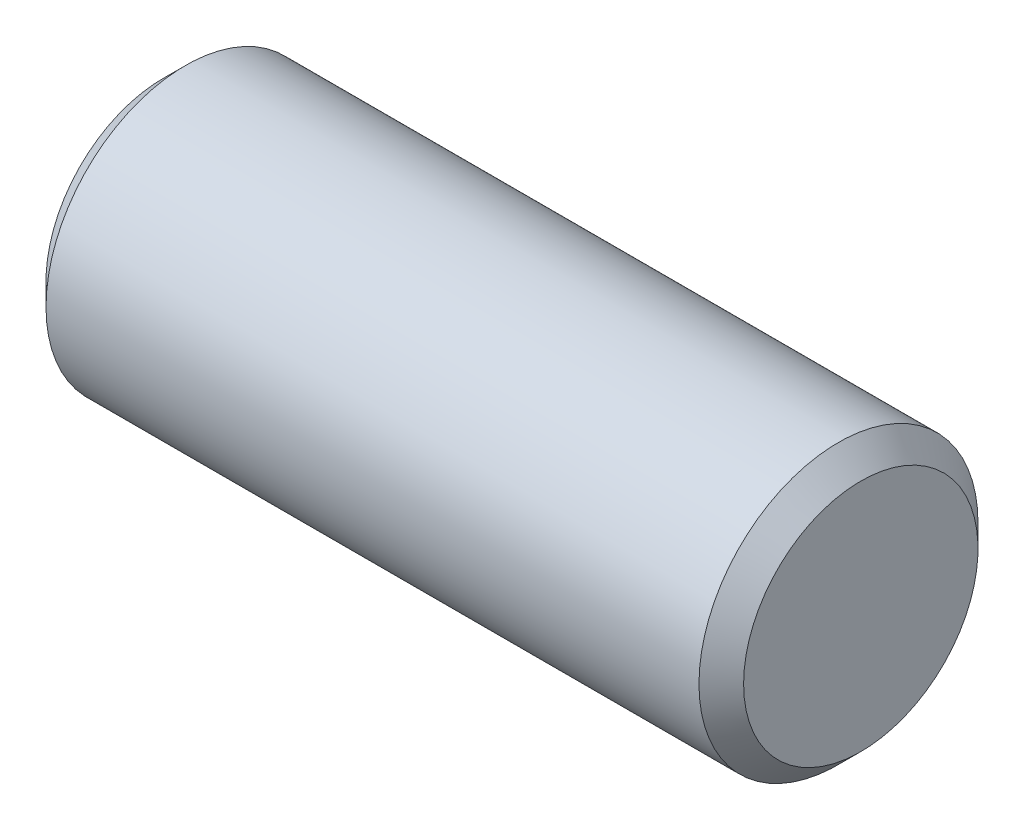
ISO-10303-21;
HEADER;
FILE_DESCRIPTION(('STEP AP214'),'2;1');
FILE_NAME('part.step','',(''),(''),'','','');
FILE_SCHEMA(('AUTOMOTIVE_DESIGN { 1 0 10303 214 1 1 1 1 }'));
ENDSEC;
DATA;
#1=APPLICATION_CONTEXT('core data for automotive mechanical design processes');
#2=APPLICATION_PROTOCOL_DEFINITION('international standard','automotive_design',2000,#1);
#3=PRODUCT_CONTEXT('',#1,'mechanical');
#4=PRODUCT('Part','Part','',(#3));
#5=PRODUCT_RELATED_PRODUCT_CATEGORY('part','',(#4));
#6=PRODUCT_DEFINITION_FORMATION('','',#4);
#7=PRODUCT_DEFINITION_CONTEXT('part definition',#1,'design');
#8=PRODUCT_DEFINITION('design','',#6,#7);
#9=PRODUCT_DEFINITION_SHAPE('','',#8);
#10=(LENGTH_UNIT() NAMED_UNIT(*) SI_UNIT(.MILLI.,.METRE.));
#11=(NAMED_UNIT(*) PLANE_ANGLE_UNIT() SI_UNIT($,.RADIAN.));
#12=(NAMED_UNIT(*) SI_UNIT($,.STERADIAN.) SOLID_ANGLE_UNIT());
#13=UNCERTAINTY_MEASURE_WITH_UNIT(LENGTH_MEASURE(1.E-05),#10,'distance_accuracy_value','');
#14=(GEOMETRIC_REPRESENTATION_CONTEXT(3) GLOBAL_UNCERTAINTY_ASSIGNED_CONTEXT((#13)) GLOBAL_UNIT_ASSIGNED_CONTEXT((#10,
#11,#12)) REPRESENTATION_CONTEXT('',''));
#15=CARTESIAN_POINT('',(0.,0.,0.));
#16=DIRECTION('',(0.,0.,1.));
#17=DIRECTION('',(1.,0.,0.));
#18=AXIS2_PLACEMENT_3D('',#15,#16,#17);
#19=CARTESIAN_POINT('',(7.9375,0.,0.));
#20=DIRECTION('',(1.,0.,0.));
#21=DIRECTION('',(0.,0.,-1.));
#22=AXIS2_PLACEMENT_3D('',#19,#20,#21);
#23=PLANE('',#22);
#24=CARTESIAN_POINT('',(7.93750000002547,0.,0.));
#25=DIRECTION('',(-1.,0.,0.));
#26=DIRECTION('',(0.,0.,1.));
#27=AXIS2_PLACEMENT_3D('',#24,#25,#26);
#28=CIRCLE('',#27,1.333499999987);
#29=CARTESIAN_POINT('',(7.93750000002547,0.,1.333499999987));
#30=VERTEX_POINT('',#29);
#31=EDGE_CURVE('E18',#30,#30,#28,.T.);
#32=ORIENTED_EDGE('',*,*,#31,.F.);
#33=EDGE_LOOP('',(#32));
#34=FACE_BOUND('',#33,.T.);
#35=ADVANCED_FACE('F15',(#34),#23,.T.);
#36=CARTESIAN_POINT('',(0.,0.,0.));
#37=DIRECTION('',(1.,0.,0.));
#38=DIRECTION('',(0.,0.,-1.));
#39=AXIS2_PLACEMENT_3D('',#36,#37,#38);
#40=PLANE('',#39);
#41=CARTESIAN_POINT('',(0.,0.,0.));
#42=DIRECTION('',(1.,0.,0.));
#43=DIRECTION('',(0.,0.,-1.));
#44=AXIS2_PLACEMENT_3D('',#41,#42,#43);
#45=CIRCLE('',#44,1.33350000004384);
#46=CARTESIAN_POINT('',(0.,0.,-1.33350000004384));
#47=VERTEX_POINT('',#46);
#48=EDGE_CURVE('E27',#47,#47,#45,.T.);
#49=ORIENTED_EDGE('',*,*,#48,.F.);
#50=EDGE_LOOP('',(#49));
#51=FACE_BOUND('',#50,.T.);
#52=ADVANCED_FACE('F38',(#51),#40,.F.);
#53=CARTESIAN_POINT('',(7.68350000004148,0.,0.));
#54=DIRECTION('',(-1.,0.,0.));
#55=DIRECTION('',(0.,0.,1.));
#56=AXIS2_PLACEMENT_3D('',#53,#54,#55);
#57=CONICAL_SURFACE('',#56,1.58749999997099,0.785398163397448);
#58=CARTESIAN_POINT('',(7.6835,0.,0.));
#59=DIRECTION('',(-1.,0.,0.));
#60=DIRECTION('',(0.,0.,1.));
#61=AXIS2_PLACEMENT_3D('',#58,#59,#60);
#62=CIRCLE('',#61,1.5875);
#63=CARTESIAN_POINT('',(7.6835,0.,1.5875));
#64=VERTEX_POINT('',#63);
#65=EDGE_CURVE('E22',#64,#64,#62,.T.);
#66=ORIENTED_EDGE('',*,*,#65,.F.);
#67=EDGE_LOOP('',(#66));
#68=FACE_BOUND('',#67,.T.);
#69=ORIENTED_EDGE('',*,*,#31,.T.);
#70=EDGE_LOOP('',(#69));
#71=FACE_BOUND('',#70,.T.);
#72=ADVANCED_FACE('F35',(#68,#71),#57,.T.);
#73=CARTESIAN_POINT('',(0.253999999983989,0.,0.));
#74=DIRECTION('',(1.,0.,0.));
#75=DIRECTION('',(0.,0.,-1.));
#76=AXIS2_PLACEMENT_3D('',#73,#74,#75);
#77=CONICAL_SURFACE('',#76,1.58750000002783,0.785398163397448);
#78=CARTESIAN_POINT('',(0.253999999999999,0.,0.));
#79=DIRECTION('',(-1.,0.,0.));
#80=DIRECTION('',(0.,0.,1.));
#81=AXIS2_PLACEMENT_3D('',#78,#79,#80);
#82=CIRCLE('',#81,1.5875);
#83=CARTESIAN_POINT('',(0.253999999999999,0.,1.5875));
#84=VERTEX_POINT('',#83);
#85=EDGE_CURVE('E10',#84,#84,#82,.F.);
#86=ORIENTED_EDGE('',*,*,#85,.F.);
#87=EDGE_LOOP('',(#86));
#88=FACE_BOUND('',#87,.T.);
#89=ORIENTED_EDGE('',*,*,#48,.T.);
#90=EDGE_LOOP('',(#89));
#91=FACE_BOUND('',#90,.T.);
#92=ADVANCED_FACE('F46',(#88,#91),#77,.T.);
#93=CARTESIAN_POINT('',(7.9375,0.,0.));
#94=DIRECTION('',(-1.,0.,0.));
#95=DIRECTION('',(0.,0.,1.));
#96=AXIS2_PLACEMENT_3D('',#93,#94,#95);
#97=CYLINDRICAL_SURFACE('',#96,1.5875);
#98=ORIENTED_EDGE('',*,*,#85,.T.);
#99=EDGE_LOOP('',(#98));
#100=FACE_BOUND('',#99,.T.);
#101=ORIENTED_EDGE('',*,*,#65,.T.);
#102=EDGE_LOOP('',(#101));
#103=FACE_BOUND('',#102,.T.);
#104=ADVANCED_FACE('F44',(#100,#103),#97,.T.);
#105=CLOSED_SHELL('',(#35,#52,#72,#92,#104));
#106=MANIFOLD_SOLID_BREP('B1',#105);
#107=ADVANCED_BREP_SHAPE_REPRESENTATION('',(#18,#106),#14);
#108=SHAPE_DEFINITION_REPRESENTATION(#9,#107);
ENDSEC;
END-ISO-10303-21;
